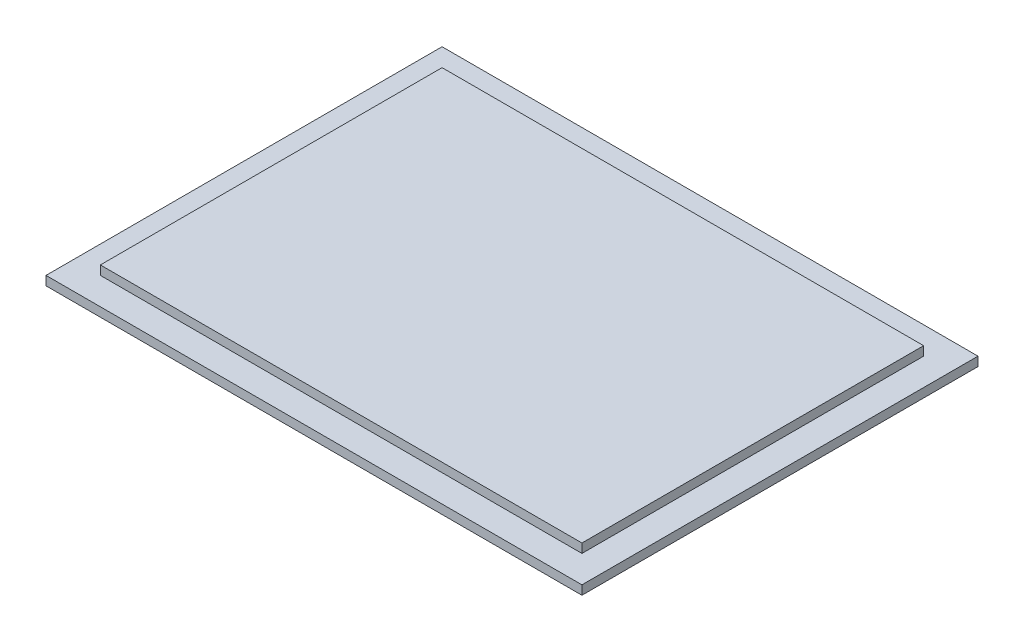
ISO-10303-21;
HEADER;
FILE_DESCRIPTION(('STEP AP214'),'2;1');
FILE_NAME('part.step','',(''),(''),'','','');
FILE_SCHEMA(('AUTOMOTIVE_DESIGN { 1 0 10303 214 1 1 1 1 }'));
ENDSEC;
DATA;
#1=APPLICATION_CONTEXT('core data for automotive mechanical design processes');
#2=APPLICATION_PROTOCOL_DEFINITION('international standard','automotive_design',2000,#1);
#3=PRODUCT_CONTEXT('',#1,'mechanical');
#4=PRODUCT('Part','Part','',(#3));
#5=PRODUCT_RELATED_PRODUCT_CATEGORY('part','',(#4));
#6=PRODUCT_DEFINITION_FORMATION('','',#4);
#7=PRODUCT_DEFINITION_CONTEXT('part definition',#1,'design');
#8=PRODUCT_DEFINITION('design','',#6,#7);
#9=PRODUCT_DEFINITION_SHAPE('','',#8);
#10=(LENGTH_UNIT() NAMED_UNIT(*) SI_UNIT(.MILLI.,.METRE.));
#11=(NAMED_UNIT(*) PLANE_ANGLE_UNIT() SI_UNIT($,.RADIAN.));
#12=(NAMED_UNIT(*) SI_UNIT($,.STERADIAN.) SOLID_ANGLE_UNIT());
#13=UNCERTAINTY_MEASURE_WITH_UNIT(LENGTH_MEASURE(1.E-05),#10,'distance_accuracy_value','');
#14=(GEOMETRIC_REPRESENTATION_CONTEXT(3) GLOBAL_UNCERTAINTY_ASSIGNED_CONTEXT((#13)) GLOBAL_UNIT_ASSIGNED_CONTEXT((#10,
#11,#12)) REPRESENTATION_CONTEXT('',''));
#15=CARTESIAN_POINT('',(0.,0.,0.));
#16=DIRECTION('',(0.,0.,1.));
#17=DIRECTION('',(1.,0.,0.));
#18=AXIS2_PLACEMENT_3D('',#15,#16,#17);
#19=CARTESIAN_POINT('',(0.,-1.,0.));
#20=DIRECTION('',(0.,-1.,0.));
#21=DIRECTION('',(0.,0.,-1.));
#22=AXIS2_PLACEMENT_3D('',#19,#20,#21);
#23=PLANE('',#22);
#24=DIRECTION('',(1.,0.,0.));
#25=VECTOR('',#24,1.);
#26=CARTESIAN_POINT('',(-29.58,-1.,-21.86));
#27=LINE('',#26,#25);
#28=CARTESIAN_POINT('',(-29.58,-1.,-21.86));
#29=VERTEX_POINT('',#28);
#30=CARTESIAN_POINT('',(29.58,-1.,-21.86));
#31=VERTEX_POINT('',#30);
#32=EDGE_CURVE('E150',#29,#31,#27,.T.);
#33=ORIENTED_EDGE('',*,*,#32,.T.);
#34=DIRECTION('',(0.,0.,1.));
#35=VECTOR('',#34,1.);
#36=CARTESIAN_POINT('',(29.58,-1.,-21.86));
#37=LINE('',#36,#35);
#38=CARTESIAN_POINT('',(29.58,-1.,21.86));
#39=VERTEX_POINT('',#38);
#40=EDGE_CURVE('E153',#31,#39,#37,.T.);
#41=ORIENTED_EDGE('',*,*,#40,.T.);
#42=DIRECTION('',(-1.,0.,0.));
#43=VECTOR('',#42,1.);
#44=CARTESIAN_POINT('',(29.58,-1.,21.86));
#45=LINE('',#44,#43);
#46=CARTESIAN_POINT('',(-29.58,-1.,21.86));
#47=VERTEX_POINT('',#46);
#48=EDGE_CURVE('E156',#39,#47,#45,.T.);
#49=ORIENTED_EDGE('',*,*,#48,.T.);
#50=DIRECTION('',(0.,0.,-1.));
#51=VECTOR('',#50,1.);
#52=CARTESIAN_POINT('',(-29.58,-1.,21.86));
#53=LINE('',#52,#51);
#54=EDGE_CURVE('E158',#47,#29,#53,.T.);
#55=ORIENTED_EDGE('',*,*,#54,.T.);
#56=EDGE_LOOP('',(#33,#41,#49,#55));
#57=FACE_BOUND('',#56,.T.);
#58=DIRECTION('',(0.,0.,1.));
#59=VECTOR('',#58,1.);
#60=CARTESIAN_POINT('',(26.58,-1.,-18.86));
#61=LINE('',#60,#59);
#62=CARTESIAN_POINT('',(26.58,-1.,-18.86));
#63=VERTEX_POINT('',#62);
#64=CARTESIAN_POINT('',(26.58,-1.,18.86));
#65=VERTEX_POINT('',#64);
#66=EDGE_CURVE('E122',#63,#65,#61,.T.);
#67=ORIENTED_EDGE('',*,*,#66,.F.);
#68=DIRECTION('',(1.,0.,0.));
#69=VECTOR('',#68,1.);
#70=CARTESIAN_POINT('',(-26.58,-1.,-18.86));
#71=LINE('',#70,#69);
#72=CARTESIAN_POINT('',(-26.58,-1.,-18.86));
#73=VERTEX_POINT('',#72);
#74=EDGE_CURVE('E114',#73,#63,#71,.T.);
#75=ORIENTED_EDGE('',*,*,#74,.F.);
#76=DIRECTION('',(0.,0.,-1.));
#77=VECTOR('',#76,1.);
#78=CARTESIAN_POINT('',(-26.58,-1.,18.86));
#79=LINE('',#78,#77);
#80=CARTESIAN_POINT('',(-26.58,-1.,18.86));
#81=VERTEX_POINT('',#80);
#82=EDGE_CURVE('E136',#81,#73,#79,.T.);
#83=ORIENTED_EDGE('',*,*,#82,.F.);
#84=DIRECTION('',(-1.,0.,0.));
#85=VECTOR('',#84,1.);
#86=CARTESIAN_POINT('',(26.58,-1.,18.86));
#87=LINE('',#86,#85);
#88=EDGE_CURVE('E134',#65,#81,#87,.T.);
#89=ORIENTED_EDGE('',*,*,#88,.F.);
#90=EDGE_LOOP('',(#67,#75,#83,#89));
#91=FACE_BOUND('',#90,.T.);
#92=ADVANCED_FACE('F49',(#57,#91),#23,.T.);
#93=CARTESIAN_POINT('',(0.,0.,0.));
#94=DIRECTION('',(0.,-1.,0.));
#95=DIRECTION('',(0.,0.,-1.));
#96=AXIS2_PLACEMENT_3D('',#93,#94,#95);
#97=PLANE('',#96);
#98=DIRECTION('',(1.,0.,0.));
#99=VECTOR('',#98,1.);
#100=CARTESIAN_POINT('',(-29.58,0.,-21.86));
#101=LINE('',#100,#99);
#102=CARTESIAN_POINT('',(-29.58,0.,-21.86));
#103=VERTEX_POINT('',#102);
#104=CARTESIAN_POINT('',(29.58,0.,-21.86));
#105=VERTEX_POINT('',#104);
#106=EDGE_CURVE('E130',#103,#105,#101,.T.);
#107=ORIENTED_EDGE('',*,*,#106,.F.);
#108=DIRECTION('',(0.,0.,-1.));
#109=VECTOR('',#108,1.);
#110=CARTESIAN_POINT('',(-29.58,0.,21.86));
#111=LINE('',#110,#109);
#112=CARTESIAN_POINT('',(-29.58,0.,21.86));
#113=VERTEX_POINT('',#112);
#114=EDGE_CURVE('E154',#113,#103,#111,.T.);
#115=ORIENTED_EDGE('',*,*,#114,.F.);
#116=DIRECTION('',(-1.,0.,0.));
#117=VECTOR('',#116,1.);
#118=CARTESIAN_POINT('',(29.58,0.,21.86));
#119=LINE('',#118,#117);
#120=CARTESIAN_POINT('',(29.58,0.,21.86));
#121=VERTEX_POINT('',#120);
#122=EDGE_CURVE('E165',#121,#113,#119,.T.);
#123=ORIENTED_EDGE('',*,*,#122,.F.);
#124=DIRECTION('',(0.,0.,1.));
#125=VECTOR('',#124,1.);
#126=CARTESIAN_POINT('',(29.58,0.,-21.86));
#127=LINE('',#126,#125);
#128=EDGE_CURVE('E163',#105,#121,#127,.T.);
#129=ORIENTED_EDGE('',*,*,#128,.F.);
#130=EDGE_LOOP('',(#107,#115,#123,#129));
#131=FACE_BOUND('',#130,.T.);
#132=DIRECTION('',(1.,0.,0.));
#133=VECTOR('',#132,1.);
#134=CARTESIAN_POINT('',(-26.58,0.,-18.86));
#135=LINE('',#134,#133);
#136=CARTESIAN_POINT('',(-26.58,0.,-18.86));
#137=VERTEX_POINT('',#136);
#138=CARTESIAN_POINT('',(26.58,0.,-18.86));
#139=VERTEX_POINT('',#138);
#140=EDGE_CURVE('E72',#137,#139,#135,.T.);
#141=ORIENTED_EDGE('',*,*,#140,.T.);
#142=DIRECTION('',(0.,0.,1.));
#143=VECTOR('',#142,1.);
#144=CARTESIAN_POINT('',(26.58,0.,-18.86));
#145=LINE('',#144,#143);
#146=CARTESIAN_POINT('',(26.58,0.,18.86));
#147=VERTEX_POINT('',#146);
#148=EDGE_CURVE('E129',#139,#147,#145,.T.);
#149=ORIENTED_EDGE('',*,*,#148,.T.);
#150=DIRECTION('',(-1.,0.,0.));
#151=VECTOR('',#150,1.);
#152=CARTESIAN_POINT('',(26.58,0.,18.86));
#153=LINE('',#152,#151);
#154=CARTESIAN_POINT('',(-26.58,0.,18.86));
#155=VERTEX_POINT('',#154);
#156=EDGE_CURVE('E142',#147,#155,#153,.T.);
#157=ORIENTED_EDGE('',*,*,#156,.T.);
#158=DIRECTION('',(0.,0.,-1.));
#159=VECTOR('',#158,1.);
#160=CARTESIAN_POINT('',(-26.58,0.,18.86));
#161=LINE('',#160,#159);
#162=EDGE_CURVE('E123',#155,#137,#161,.T.);
#163=ORIENTED_EDGE('',*,*,#162,.T.);
#164=EDGE_LOOP('',(#141,#149,#157,#163));
#165=FACE_BOUND('',#164,.T.);
#166=ADVANCED_FACE('F183',(#131,#165),#97,.F.);
#167=CARTESIAN_POINT('',(-29.58,-1.,-21.86));
#168=DIRECTION('',(0.,0.,1.));
#169=DIRECTION('',(1.,0.,0.));
#170=AXIS2_PLACEMENT_3D('',#167,#168,#169);
#171=PLANE('',#170);
#172=ORIENTED_EDGE('',*,*,#106,.T.);
#173=DIRECTION('',(0.,1.,0.));
#174=VECTOR('',#173,1.);
#175=CARTESIAN_POINT('',(29.58,-1.,-21.86));
#176=LINE('',#175,#174);
#177=EDGE_CURVE('E12',#31,#105,#176,.T.);
#178=ORIENTED_EDGE('',*,*,#177,.F.);
#179=ORIENTED_EDGE('',*,*,#32,.F.);
#180=DIRECTION('',(0.,1.,0.));
#181=VECTOR('',#180,1.);
#182=CARTESIAN_POINT('',(-29.58,-1.,-21.86));
#183=LINE('',#182,#181);
#184=EDGE_CURVE('E160',#29,#103,#183,.T.);
#185=ORIENTED_EDGE('',*,*,#184,.T.);
#186=EDGE_LOOP('',(#172,#178,#179,#185));
#187=FACE_BOUND('',#186,.T.);
#188=ADVANCED_FACE('F51',(#187),#171,.F.);
#189=CARTESIAN_POINT('',(29.58,-1.,-21.86));
#190=DIRECTION('',(-1.,0.,0.));
#191=DIRECTION('',(0.,0.,1.));
#192=AXIS2_PLACEMENT_3D('',#189,#190,#191);
#193=PLANE('',#192);
#194=ORIENTED_EDGE('',*,*,#128,.T.);
#195=DIRECTION('',(0.,1.,0.));
#196=VECTOR('',#195,1.);
#197=CARTESIAN_POINT('',(29.58,-1.,21.86));
#198=LINE('',#197,#196);
#199=EDGE_CURVE('E57',#39,#121,#198,.T.);
#200=ORIENTED_EDGE('',*,*,#199,.F.);
#201=ORIENTED_EDGE('',*,*,#40,.F.);
#202=ORIENTED_EDGE('',*,*,#177,.T.);
#203=EDGE_LOOP('',(#194,#200,#201,#202));
#204=FACE_BOUND('',#203,.T.);
#205=ADVANCED_FACE('F193',(#204),#193,.F.);
#206=CARTESIAN_POINT('',(29.58,-1.,21.86));
#207=DIRECTION('',(0.,0.,-1.));
#208=DIRECTION('',(-1.,0.,0.));
#209=AXIS2_PLACEMENT_3D('',#206,#207,#208);
#210=PLANE('',#209);
#211=ORIENTED_EDGE('',*,*,#122,.T.);
#212=DIRECTION('',(0.,1.,0.));
#213=VECTOR('',#212,1.);
#214=CARTESIAN_POINT('',(-29.58,-1.,21.86));
#215=LINE('',#214,#213);
#216=EDGE_CURVE('E170',#47,#113,#215,.T.);
#217=ORIENTED_EDGE('',*,*,#216,.F.);
#218=ORIENTED_EDGE('',*,*,#48,.F.);
#219=ORIENTED_EDGE('',*,*,#199,.T.);
#220=EDGE_LOOP('',(#211,#217,#218,#219));
#221=FACE_BOUND('',#220,.T.);
#222=ADVANCED_FACE('F177',(#221),#210,.F.);
#223=CARTESIAN_POINT('',(-29.58,-1.,21.86));
#224=DIRECTION('',(1.,0.,0.));
#225=DIRECTION('',(0.,0.,-1.));
#226=AXIS2_PLACEMENT_3D('',#223,#224,#225);
#227=PLANE('',#226);
#228=ORIENTED_EDGE('',*,*,#114,.T.);
#229=ORIENTED_EDGE('',*,*,#184,.F.);
#230=ORIENTED_EDGE('',*,*,#54,.F.);
#231=ORIENTED_EDGE('',*,*,#216,.T.);
#232=EDGE_LOOP('',(#228,#229,#230,#231));
#233=FACE_BOUND('',#232,.T.);
#234=ADVANCED_FACE('F187',(#233),#227,.F.);
#235=CARTESIAN_POINT('',(-26.58,-1.,-18.86));
#236=DIRECTION('',(0.,0.,1.));
#237=DIRECTION('',(1.,0.,0.));
#238=AXIS2_PLACEMENT_3D('',#235,#236,#237);
#239=PLANE('',#238);
#240=ORIENTED_EDGE('',*,*,#140,.F.);
#241=DIRECTION('',(0.,1.,0.));
#242=VECTOR('',#241,1.);
#243=CARTESIAN_POINT('',(-26.58,-1.,-18.86));
#244=LINE('',#243,#242);
#245=EDGE_CURVE('E118',#73,#137,#244,.T.);
#246=ORIENTED_EDGE('',*,*,#245,.F.);
#247=ORIENTED_EDGE('',*,*,#74,.T.);
#248=DIRECTION('',(0.,1.,0.));
#249=VECTOR('',#248,1.);
#250=CARTESIAN_POINT('',(26.58,-1.,-18.86));
#251=LINE('',#250,#249);
#252=EDGE_CURVE('E117',#63,#139,#251,.T.);
#253=ORIENTED_EDGE('',*,*,#252,.T.);
#254=EDGE_LOOP('',(#240,#246,#247,#253));
#255=FACE_BOUND('',#254,.T.);
#256=ADVANCED_FACE('F116',(#255),#239,.T.);
#257=CARTESIAN_POINT('',(26.58,-1.,-18.86));
#258=DIRECTION('',(-1.,0.,0.));
#259=DIRECTION('',(0.,0.,1.));
#260=AXIS2_PLACEMENT_3D('',#257,#258,#259);
#261=PLANE('',#260);
#262=ORIENTED_EDGE('',*,*,#148,.F.);
#263=ORIENTED_EDGE('',*,*,#252,.F.);
#264=ORIENTED_EDGE('',*,*,#66,.T.);
#265=DIRECTION('',(0.,1.,0.));
#266=VECTOR('',#265,1.);
#267=CARTESIAN_POINT('',(26.58,-1.,18.86));
#268=LINE('',#267,#266);
#269=EDGE_CURVE('E131',#65,#147,#268,.T.);
#270=ORIENTED_EDGE('',*,*,#269,.T.);
#271=EDGE_LOOP('',(#262,#263,#264,#270));
#272=FACE_BOUND('',#271,.T.);
#273=ADVANCED_FACE('F126',(#272),#261,.T.);
#274=CARTESIAN_POINT('',(26.58,-1.,18.86));
#275=DIRECTION('',(0.,0.,-1.));
#276=DIRECTION('',(-1.,0.,0.));
#277=AXIS2_PLACEMENT_3D('',#274,#275,#276);
#278=PLANE('',#277);
#279=ORIENTED_EDGE('',*,*,#156,.F.);
#280=ORIENTED_EDGE('',*,*,#269,.F.);
#281=ORIENTED_EDGE('',*,*,#88,.T.);
#282=DIRECTION('',(0.,1.,0.));
#283=VECTOR('',#282,1.);
#284=CARTESIAN_POINT('',(-26.58,-1.,18.86));
#285=LINE('',#284,#283);
#286=EDGE_CURVE('E64',#81,#155,#285,.T.);
#287=ORIENTED_EDGE('',*,*,#286,.T.);
#288=EDGE_LOOP('',(#279,#280,#281,#287));
#289=FACE_BOUND('',#288,.T.);
#290=ADVANCED_FACE('F216',(#289),#278,.T.);
#291=CARTESIAN_POINT('',(-26.58,-1.,18.86));
#292=DIRECTION('',(1.,0.,0.));
#293=DIRECTION('',(0.,0.,-1.));
#294=AXIS2_PLACEMENT_3D('',#291,#292,#293);
#295=PLANE('',#294);
#296=ORIENTED_EDGE('',*,*,#162,.F.);
#297=ORIENTED_EDGE('',*,*,#286,.F.);
#298=ORIENTED_EDGE('',*,*,#82,.T.);
#299=ORIENTED_EDGE('',*,*,#245,.T.);
#300=EDGE_LOOP('',(#296,#297,#298,#299));
#301=FACE_BOUND('',#300,.T.);
#302=ADVANCED_FACE('F220',(#301),#295,.T.);
#303=CLOSED_SHELL('',(#92,#166,#188,#205,#222,#234,#256,#273,#290,#302));
#304=MANIFOLD_SOLID_BREP('B2',#303);
#305=CARTESIAN_POINT('',(26.58,1.,-18.86));
#306=DIRECTION('',(-1.,0.,0.));
#307=DIRECTION('',(0.,0.,1.));
#308=AXIS2_PLACEMENT_3D('',#305,#306,#307);
#309=PLANE('',#308);
#310=DIRECTION('',(0.,0.,-1.));
#311=VECTOR('',#310,1.);
#312=CARTESIAN_POINT('',(26.58,0.,-18.86));
#313=LINE('',#312,#311);
#314=CARTESIAN_POINT('',(26.58,0.,18.86));
#315=VERTEX_POINT('',#314);
#316=CARTESIAN_POINT('',(26.58,0.,-18.86));
#317=VERTEX_POINT('',#316);
#318=EDGE_CURVE('E347',#315,#317,#313,.T.);
#319=ORIENTED_EDGE('',*,*,#318,.T.);
#320=DIRECTION('',(0.,-1.,0.));
#321=VECTOR('',#320,1.);
#322=CARTESIAN_POINT('',(26.58,1.,-18.86));
#323=LINE('',#322,#321);
#324=CARTESIAN_POINT('',(26.58,1.,-18.86));
#325=VERTEX_POINT('',#324);
#326=EDGE_CURVE('E47',#325,#317,#323,.T.);
#327=ORIENTED_EDGE('',*,*,#326,.F.);
#328=DIRECTION('',(0.,0.,-1.));
#329=VECTOR('',#328,1.);
#330=CARTESIAN_POINT('',(26.58,1.,-18.86));
#331=LINE('',#330,#329);
#332=CARTESIAN_POINT('',(26.58,1.,18.86));
#333=VERTEX_POINT('',#332);
#334=EDGE_CURVE('E331',#333,#325,#331,.T.);
#335=ORIENTED_EDGE('',*,*,#334,.F.);
#336=DIRECTION('',(0.,-1.,0.));
#337=VECTOR('',#336,1.);
#338=CARTESIAN_POINT('',(26.58,1.,18.86));
#339=LINE('',#338,#337);
#340=EDGE_CURVE('E343',#333,#315,#339,.T.);
#341=ORIENTED_EDGE('',*,*,#340,.T.);
#342=EDGE_LOOP('',(#319,#327,#335,#341));
#343=FACE_BOUND('',#342,.T.);
#344=ADVANCED_FACE('F279',(#343),#309,.F.);
#345=CARTESIAN_POINT('',(-26.58,1.,-18.86));
#346=DIRECTION('',(0.,0.,1.));
#347=DIRECTION('',(1.,0.,0.));
#348=AXIS2_PLACEMENT_3D('',#345,#346,#347);
#349=PLANE('',#348);
#350=DIRECTION('',(-1.,0.,0.));
#351=VECTOR('',#350,1.);
#352=CARTESIAN_POINT('',(-26.58,0.,-18.86));
#353=LINE('',#352,#351);
#354=CARTESIAN_POINT('',(-26.58,0.,-18.86));
#355=VERTEX_POINT('',#354);
#356=EDGE_CURVE('E336',#317,#355,#353,.T.);
#357=ORIENTED_EDGE('',*,*,#356,.T.);
#358=DIRECTION('',(0.,-1.,0.));
#359=VECTOR('',#358,1.);
#360=CARTESIAN_POINT('',(-26.58,1.,-18.86));
#361=LINE('',#360,#359);
#362=CARTESIAN_POINT('',(-26.58,1.,-18.86));
#363=VERTEX_POINT('',#362);
#364=EDGE_CURVE('E288',#363,#355,#361,.T.);
#365=ORIENTED_EDGE('',*,*,#364,.F.);
#366=DIRECTION('',(-1.,0.,0.));
#367=VECTOR('',#366,1.);
#368=CARTESIAN_POINT('',(-26.58,1.,-18.86));
#369=LINE('',#368,#367);
#370=EDGE_CURVE('E326',#325,#363,#369,.T.);
#371=ORIENTED_EDGE('',*,*,#370,.F.);
#372=ORIENTED_EDGE('',*,*,#326,.T.);
#373=EDGE_LOOP('',(#357,#365,#371,#372));
#374=FACE_BOUND('',#373,.T.);
#375=ADVANCED_FACE('F335',(#374),#349,.F.);
#376=CARTESIAN_POINT('',(-26.58,1.,-18.86));
#377=DIRECTION('',(1.,0.,0.));
#378=DIRECTION('',(0.,0.,-1.));
#379=AXIS2_PLACEMENT_3D('',#376,#377,#378);
#380=PLANE('',#379);
#381=DIRECTION('',(0.,0.,1.));
#382=VECTOR('',#381,1.);
#383=CARTESIAN_POINT('',(-26.58,0.,-18.86));
#384=LINE('',#383,#382);
#385=CARTESIAN_POINT('',(-26.58,0.,18.86));
#386=VERTEX_POINT('',#385);
#387=EDGE_CURVE('E313',#355,#386,#384,.T.);
#388=ORIENTED_EDGE('',*,*,#387,.T.);
#389=DIRECTION('',(0.,-1.,0.));
#390=VECTOR('',#389,1.);
#391=CARTESIAN_POINT('',(-26.58,1.,18.86));
#392=LINE('',#391,#390);
#393=CARTESIAN_POINT('',(-26.58,1.,18.86));
#394=VERTEX_POINT('',#393);
#395=EDGE_CURVE('E338',#394,#386,#392,.T.);
#396=ORIENTED_EDGE('',*,*,#395,.F.);
#397=DIRECTION('',(0.,0.,1.));
#398=VECTOR('',#397,1.);
#399=CARTESIAN_POINT('',(-26.58,1.,-18.86));
#400=LINE('',#399,#398);
#401=EDGE_CURVE('E329',#363,#394,#400,.T.);
#402=ORIENTED_EDGE('',*,*,#401,.F.);
#403=ORIENTED_EDGE('',*,*,#364,.T.);
#404=EDGE_LOOP('',(#388,#396,#402,#403));
#405=FACE_BOUND('',#404,.T.);
#406=ADVANCED_FACE('F339',(#405),#380,.F.);
#407=CARTESIAN_POINT('',(-26.58,1.,18.86));
#408=DIRECTION('',(0.,0.,-1.));
#409=DIRECTION('',(-1.,0.,0.));
#410=AXIS2_PLACEMENT_3D('',#407,#408,#409);
#411=PLANE('',#410);
#412=DIRECTION('',(1.,0.,0.));
#413=VECTOR('',#412,1.);
#414=CARTESIAN_POINT('',(-26.58,0.,18.86));
#415=LINE('',#414,#413);
#416=EDGE_CURVE('E319',#386,#315,#415,.T.);
#417=ORIENTED_EDGE('',*,*,#416,.T.);
#418=ORIENTED_EDGE('',*,*,#340,.F.);
#419=DIRECTION('',(1.,0.,0.));
#420=VECTOR('',#419,1.);
#421=CARTESIAN_POINT('',(-26.58,1.,18.86));
#422=LINE('',#421,#420);
#423=EDGE_CURVE('E296',#394,#333,#422,.T.);
#424=ORIENTED_EDGE('',*,*,#423,.F.);
#425=ORIENTED_EDGE('',*,*,#395,.T.);
#426=EDGE_LOOP('',(#417,#418,#424,#425));
#427=FACE_BOUND('',#426,.T.);
#428=ADVANCED_FACE('F360',(#427),#411,.F.);
#429=CARTESIAN_POINT('',(0.,1.,0.));
#430=DIRECTION('',(0.,1.,0.));
#431=DIRECTION('',(0.,0.,1.));
#432=AXIS2_PLACEMENT_3D('',#429,#430,#431);
#433=PLANE('',#432);
#434=ORIENTED_EDGE('',*,*,#334,.T.);
#435=ORIENTED_EDGE('',*,*,#370,.T.);
#436=ORIENTED_EDGE('',*,*,#401,.T.);
#437=ORIENTED_EDGE('',*,*,#423,.T.);
#438=EDGE_LOOP('',(#434,#435,#436,#437));
#439=FACE_BOUND('',#438,.T.);
#440=ADVANCED_FACE('F327',(#439),#433,.T.);
#441=CARTESIAN_POINT('',(0.,0.,0.));
#442=DIRECTION('',(0.,1.,0.));
#443=DIRECTION('',(0.,0.,1.));
#444=AXIS2_PLACEMENT_3D('',#441,#442,#443);
#445=PLANE('',#444);
#446=ORIENTED_EDGE('',*,*,#318,.F.);
#447=ORIENTED_EDGE('',*,*,#416,.F.);
#448=ORIENTED_EDGE('',*,*,#387,.F.);
#449=ORIENTED_EDGE('',*,*,#356,.F.);
#450=EDGE_LOOP('',(#446,#447,#448,#449));
#451=FACE_BOUND('',#450,.T.);
#452=ADVANCED_FACE('F363',(#451),#445,.F.);
#453=CLOSED_SHELL('',(#344,#375,#406,#428,#440,#452));
#454=MANIFOLD_SOLID_BREP('B6',#453);
#455=ADVANCED_BREP_SHAPE_REPRESENTATION('',(#18,#304,#454),#14);
#456=SHAPE_DEFINITION_REPRESENTATION(#9,#455);
ENDSEC;
END-ISO-10303-21;
